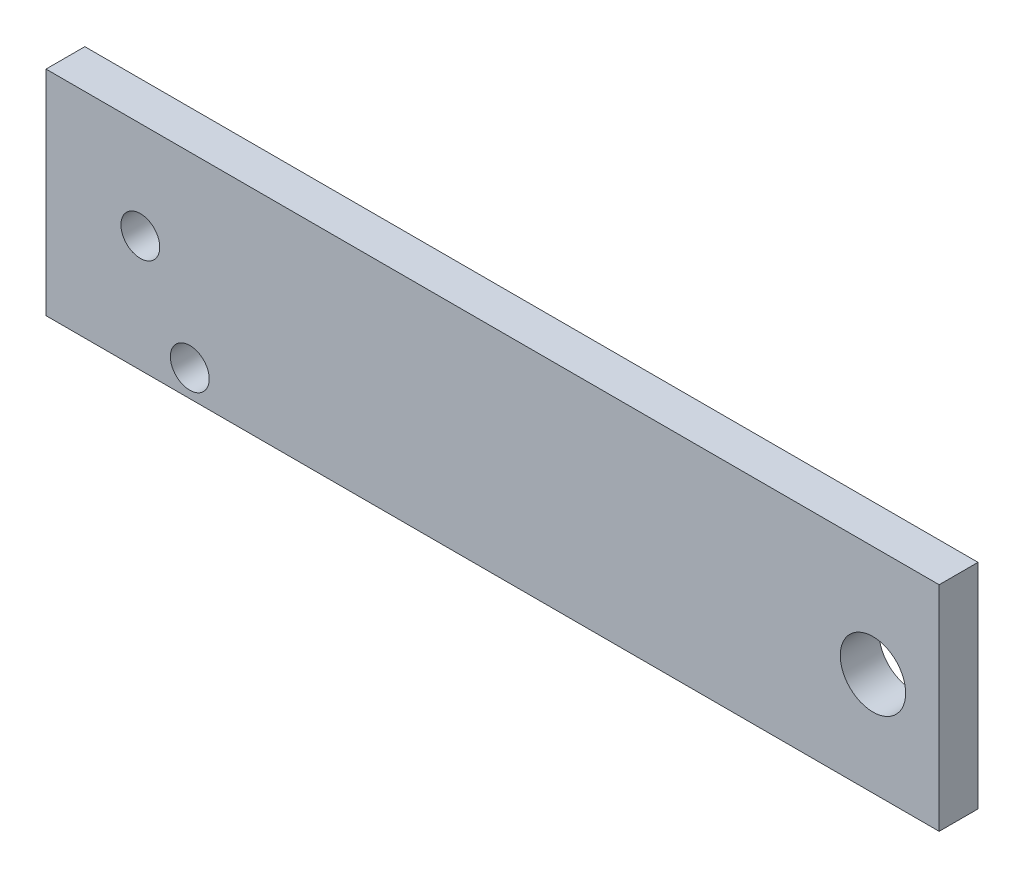
ISO-10303-21;
HEADER;
FILE_DESCRIPTION(('STEP AP214'),'2;1');
FILE_NAME('part.step','',(''),(''),'','','');
FILE_SCHEMA(('AUTOMOTIVE_DESIGN { 1 0 10303 214 1 1 1 1 }'));
ENDSEC;
DATA;
#1=APPLICATION_CONTEXT('core data for automotive mechanical design processes');
#2=APPLICATION_PROTOCOL_DEFINITION('international standard','automotive_design',2000,#1);
#3=PRODUCT_CONTEXT('',#1,'mechanical');
#4=PRODUCT('Part','Part','',(#3));
#5=PRODUCT_RELATED_PRODUCT_CATEGORY('part','',(#4));
#6=PRODUCT_DEFINITION_FORMATION('','',#4);
#7=PRODUCT_DEFINITION_CONTEXT('part definition',#1,'design');
#8=PRODUCT_DEFINITION('design','',#6,#7);
#9=PRODUCT_DEFINITION_SHAPE('','',#8);
#10=(LENGTH_UNIT() NAMED_UNIT(*) SI_UNIT(.MILLI.,.METRE.));
#11=(NAMED_UNIT(*) PLANE_ANGLE_UNIT() SI_UNIT($,.RADIAN.));
#12=(NAMED_UNIT(*) SI_UNIT($,.STERADIAN.) SOLID_ANGLE_UNIT());
#13=UNCERTAINTY_MEASURE_WITH_UNIT(LENGTH_MEASURE(1.E-05),#10,'distance_accuracy_value','');
#14=(GEOMETRIC_REPRESENTATION_CONTEXT(3) GLOBAL_UNCERTAINTY_ASSIGNED_CONTEXT((#13)) GLOBAL_UNIT_ASSIGNED_CONTEXT((#10,
#11,#12)) REPRESENTATION_CONTEXT('',''));
#15=CARTESIAN_POINT('',(0.,0.,0.));
#16=DIRECTION('',(0.,0.,1.));
#17=DIRECTION('',(1.,0.,0.));
#18=AXIS2_PLACEMENT_3D('',#15,#16,#17);
#19=CARTESIAN_POINT('',(0.,0.,20.));
#20=DIRECTION('',(0.,0.,-1.));
#21=DIRECTION('',(-1.,0.,0.));
#22=AXIS2_PLACEMENT_3D('',#19,#20,#21);
#23=PLANE('',#22);
#24=CARTESIAN_POINT('',(-201.422811836563,59.8413845588521,20.));
#25=DIRECTION('',(0.,0.,1.));
#26=DIRECTION('',(1.,0.,0.));
#27=AXIS2_PLACEMENT_3D('',#24,#25,#26);
#28=CIRCLE('',#27,9.99999999999979);
#29=CARTESIAN_POINT('',(-191.422811836563,59.8413845588521,20.));
#30=VERTEX_POINT('',#29);
#31=EDGE_CURVE('E104',#30,#30,#28,.T.);
#32=ORIENTED_EDGE('',*,*,#31,.F.);
#33=EDGE_LOOP('',(#32));
#34=FACE_BOUND('',#33,.T.);
#35=CARTESIAN_POINT('',(175.900033462793,52.9971265455307,20.));
#36=DIRECTION('',(0.,0.,1.));
#37=DIRECTION('',(1.,0.,0.));
#38=AXIS2_PLACEMENT_3D('',#35,#36,#37);
#39=CIRCLE('',#38,16.8442580133217);
#40=CARTESIAN_POINT('',(192.744291476115,52.9971265455307,20.));
#41=VERTEX_POINT('',#40);
#42=EDGE_CURVE('E116',#41,#41,#39,.T.);
#43=ORIENTED_EDGE('',*,*,#42,.F.);
#44=EDGE_LOOP('',(#43));
#45=FACE_BOUND('',#44,.T.);
#46=CARTESIAN_POINT('',(-175.946812600245,13.7777541788056,20.));
#47=DIRECTION('',(0.,0.,1.));
#48=DIRECTION('',(1.,0.,0.));
#49=AXIS2_PLACEMENT_3D('',#46,#47,#48);
#50=CIRCLE('',#49,9.99999999999979);
#51=CARTESIAN_POINT('',(-165.946812600245,13.7777541788056,20.));
#52=VERTEX_POINT('',#51);
#53=EDGE_CURVE('E112',#52,#52,#50,.T.);
#54=ORIENTED_EDGE('',*,*,#53,.F.);
#55=EDGE_LOOP('',(#54));
#56=FACE_BOUND('',#55,.T.);
#57=DIRECTION('',(0.,-1.,0.));
#58=VECTOR('',#57,1.);
#59=CARTESIAN_POINT('',(210.,0.,20.));
#60=LINE('',#59,#58);
#61=CARTESIAN_POINT('',(210.,110.,20.));
#62=VERTEX_POINT('',#61);
#63=CARTESIAN_POINT('',(210.,0.,20.));
#64=VERTEX_POINT('',#63);
#65=EDGE_CURVE('E57',#62,#64,#60,.T.);
#66=ORIENTED_EDGE('',*,*,#65,.F.);
#67=DIRECTION('',(-1.,0.,0.));
#68=VECTOR('',#67,1.);
#69=CARTESIAN_POINT('',(250.,110.,20.));
#70=LINE('',#69,#68);
#71=CARTESIAN_POINT('',(-250.,110.,20.));
#72=VERTEX_POINT('',#71);
#73=EDGE_CURVE('E93',#62,#72,#70,.T.);
#74=ORIENTED_EDGE('',*,*,#73,.T.);
#75=DIRECTION('',(0.,-1.,0.));
#76=VECTOR('',#75,1.);
#77=CARTESIAN_POINT('',(-250.,110.,20.));
#78=LINE('',#77,#76);
#79=CARTESIAN_POINT('',(-250.,2.22044604925031E-13,20.));
#80=VERTEX_POINT('',#79);
#81=EDGE_CURVE('E124',#72,#80,#78,.T.);
#82=ORIENTED_EDGE('',*,*,#81,.T.);
#83=DIRECTION('',(1.,0.,0.));
#84=VECTOR('',#83,1.);
#85=CARTESIAN_POINT('',(250.,0.,20.));
#86=LINE('',#85,#84);
#87=EDGE_CURVE('E123',#80,#64,#86,.T.);
#88=ORIENTED_EDGE('',*,*,#87,.T.);
#89=EDGE_LOOP('',(#66,#74,#82,#88));
#90=FACE_BOUND('',#89,.T.);
#91=ADVANCED_FACE('F41',(#34,#45,#56,#90),#23,.F.);
#92=CARTESIAN_POINT('',(0.,0.,0.));
#93=DIRECTION('',(0.,0.,-1.));
#94=DIRECTION('',(-1.,0.,0.));
#95=AXIS2_PLACEMENT_3D('',#92,#93,#94);
#96=PLANE('',#95);
#97=CARTESIAN_POINT('',(-201.422811836563,59.8413845588521,0.));
#98=DIRECTION('',(0.,0.,1.));
#99=DIRECTION('',(1.,0.,0.));
#100=AXIS2_PLACEMENT_3D('',#97,#98,#99);
#101=CIRCLE('',#100,9.99999999999979);
#102=CARTESIAN_POINT('',(-191.422811836563,59.8413845588521,0.));
#103=VERTEX_POINT('',#102);
#104=EDGE_CURVE('E105',#103,#103,#101,.T.);
#105=ORIENTED_EDGE('',*,*,#104,.T.);
#106=EDGE_LOOP('',(#105));
#107=FACE_BOUND('',#106,.T.);
#108=CARTESIAN_POINT('',(175.900033462793,52.9971265455307,0.));
#109=DIRECTION('',(0.,0.,1.));
#110=DIRECTION('',(1.,0.,0.));
#111=AXIS2_PLACEMENT_3D('',#108,#109,#110);
#112=CIRCLE('',#111,16.8442580133217);
#113=CARTESIAN_POINT('',(192.744291476115,52.9971265455307,0.));
#114=VERTEX_POINT('',#113);
#115=EDGE_CURVE('E111',#114,#114,#112,.T.);
#116=ORIENTED_EDGE('',*,*,#115,.T.);
#117=EDGE_LOOP('',(#116));
#118=FACE_BOUND('',#117,.T.);
#119=CARTESIAN_POINT('',(-175.946812600245,13.7777541788056,0.));
#120=DIRECTION('',(0.,0.,1.));
#121=DIRECTION('',(1.,0.,0.));
#122=AXIS2_PLACEMENT_3D('',#119,#120,#121);
#123=CIRCLE('',#122,9.99999999999979);
#124=CARTESIAN_POINT('',(-165.946812600245,13.7777541788056,0.));
#125=VERTEX_POINT('',#124);
#126=EDGE_CURVE('E107',#125,#125,#123,.T.);
#127=ORIENTED_EDGE('',*,*,#126,.T.);
#128=EDGE_LOOP('',(#127));
#129=FACE_BOUND('',#128,.T.);
#130=DIRECTION('',(-1.,0.,0.));
#131=VECTOR('',#130,1.);
#132=CARTESIAN_POINT('',(250.,110.,0.));
#133=LINE('',#132,#131);
#134=CARTESIAN_POINT('',(210.,110.,0.));
#135=VERTEX_POINT('',#134);
#136=CARTESIAN_POINT('',(-250.,110.,0.));
#137=VERTEX_POINT('',#136);
#138=EDGE_CURVE('E100',#135,#137,#133,.T.);
#139=ORIENTED_EDGE('',*,*,#138,.F.);
#140=DIRECTION('',(0.,-1.,0.));
#141=VECTOR('',#140,1.);
#142=CARTESIAN_POINT('',(210.,0.,0.));
#143=LINE('',#142,#141);
#144=CARTESIAN_POINT('',(210.,0.,0.));
#145=VERTEX_POINT('',#144);
#146=EDGE_CURVE('E92',#135,#145,#143,.T.);
#147=ORIENTED_EDGE('',*,*,#146,.T.);
#148=DIRECTION('',(1.,0.,0.));
#149=VECTOR('',#148,1.);
#150=CARTESIAN_POINT('',(250.,0.,0.));
#151=LINE('',#150,#149);
#152=CARTESIAN_POINT('',(-250.,2.22044604925031E-13,0.));
#153=VERTEX_POINT('',#152);
#154=EDGE_CURVE('E84',#153,#145,#151,.T.);
#155=ORIENTED_EDGE('',*,*,#154,.F.);
#156=DIRECTION('',(0.,-1.,0.));
#157=VECTOR('',#156,1.);
#158=CARTESIAN_POINT('',(-250.,110.,0.));
#159=LINE('',#158,#157);
#160=EDGE_CURVE('E95',#137,#153,#159,.T.);
#161=ORIENTED_EDGE('',*,*,#160,.F.);
#162=EDGE_LOOP('',(#139,#147,#155,#161));
#163=FACE_BOUND('',#162,.T.);
#164=ADVANCED_FACE('F96',(#107,#118,#129,#163),#96,.T.);
#165=CARTESIAN_POINT('',(250.,110.,20.));
#166=DIRECTION('',(0.,-1.,0.));
#167=DIRECTION('',(1.,0.,0.));
#168=AXIS2_PLACEMENT_3D('',#165,#166,#167);
#169=PLANE('',#168);
#170=DIRECTION('',(0.,0.,1.));
#171=VECTOR('',#170,1.);
#172=CARTESIAN_POINT('',(210.,110.,20.));
#173=LINE('',#172,#171);
#174=EDGE_CURVE('E65',#135,#62,#173,.T.);
#175=ORIENTED_EDGE('',*,*,#174,.F.);
#176=ORIENTED_EDGE('',*,*,#138,.T.);
#177=DIRECTION('',(0.,0.,-1.));
#178=VECTOR('',#177,1.);
#179=CARTESIAN_POINT('',(-250.,110.,20.));
#180=LINE('',#179,#178);
#181=EDGE_CURVE('E47',#72,#137,#180,.T.);
#182=ORIENTED_EDGE('',*,*,#181,.F.);
#183=ORIENTED_EDGE('',*,*,#73,.F.);
#184=EDGE_LOOP('',(#175,#176,#182,#183));
#185=FACE_BOUND('',#184,.T.);
#186=ADVANCED_FACE('F43',(#185),#169,.F.);
#187=CARTESIAN_POINT('',(250.,0.,20.));
#188=DIRECTION('',(0.,1.,0.));
#189=DIRECTION('',(-1.,0.,0.));
#190=AXIS2_PLACEMENT_3D('',#187,#188,#189);
#191=PLANE('',#190);
#192=DIRECTION('',(0.,0.,-1.));
#193=VECTOR('',#192,1.);
#194=CARTESIAN_POINT('',(210.,0.,20.));
#195=LINE('',#194,#193);
#196=EDGE_CURVE('E11',#64,#145,#195,.T.);
#197=ORIENTED_EDGE('',*,*,#196,.F.);
#198=ORIENTED_EDGE('',*,*,#87,.F.);
#199=DIRECTION('',(0.,0.,-1.));
#200=VECTOR('',#199,1.);
#201=CARTESIAN_POINT('',(-250.,2.22044604925031E-13,20.));
#202=LINE('',#201,#200);
#203=EDGE_CURVE('E86',#80,#153,#202,.T.);
#204=ORIENTED_EDGE('',*,*,#203,.T.);
#205=ORIENTED_EDGE('',*,*,#154,.T.);
#206=EDGE_LOOP('',(#197,#198,#204,#205));
#207=FACE_BOUND('',#206,.T.);
#208=ADVANCED_FACE('F83',(#207),#191,.F.);
#209=CARTESIAN_POINT('',(-250.,110.,20.));
#210=DIRECTION('',(1.,0.,0.));
#211=DIRECTION('',(0.,0.,-1.));
#212=AXIS2_PLACEMENT_3D('',#209,#210,#211);
#213=PLANE('',#212);
#214=ORIENTED_EDGE('',*,*,#160,.T.);
#215=ORIENTED_EDGE('',*,*,#203,.F.);
#216=ORIENTED_EDGE('',*,*,#81,.F.);
#217=ORIENTED_EDGE('',*,*,#181,.T.);
#218=EDGE_LOOP('',(#214,#215,#216,#217));
#219=FACE_BOUND('',#218,.T.);
#220=ADVANCED_FACE('F135',(#219),#213,.F.);
#221=CARTESIAN_POINT('',(175.900033462793,52.9971265455307,20.));
#222=DIRECTION('',(0.,0.,-1.));
#223=DIRECTION('',(-1.,0.,0.));
#224=AXIS2_PLACEMENT_3D('',#221,#222,#223);
#225=CYLINDRICAL_SURFACE('',#224,16.8442580133217);
#226=ORIENTED_EDGE('',*,*,#42,.T.);
#227=EDGE_LOOP('',(#226));
#228=FACE_BOUND('',#227,.T.);
#229=ORIENTED_EDGE('',*,*,#115,.F.);
#230=EDGE_LOOP('',(#229));
#231=FACE_BOUND('',#230,.T.);
#232=ADVANCED_FACE('F148',(#228,#231),#225,.F.);
#233=CARTESIAN_POINT('',(-175.946812600245,13.7777541788056,20.));
#234=DIRECTION('',(0.,0.,-1.));
#235=DIRECTION('',(-1.,0.,0.));
#236=AXIS2_PLACEMENT_3D('',#233,#234,#235);
#237=CYLINDRICAL_SURFACE('',#236,9.99999999999979);
#238=ORIENTED_EDGE('',*,*,#53,.T.);
#239=EDGE_LOOP('',(#238));
#240=FACE_BOUND('',#239,.T.);
#241=ORIENTED_EDGE('',*,*,#126,.F.);
#242=EDGE_LOOP('',(#241));
#243=FACE_BOUND('',#242,.T.);
#244=ADVANCED_FACE('F152',(#240,#243),#237,.F.);
#245=CARTESIAN_POINT('',(-201.422811836563,59.8413845588521,20.));
#246=DIRECTION('',(0.,0.,-1.));
#247=DIRECTION('',(-1.,0.,0.));
#248=AXIS2_PLACEMENT_3D('',#245,#246,#247);
#249=CYLINDRICAL_SURFACE('',#248,9.99999999999979);
#250=ORIENTED_EDGE('',*,*,#31,.T.);
#251=EDGE_LOOP('',(#250));
#252=FACE_BOUND('',#251,.T.);
#253=ORIENTED_EDGE('',*,*,#104,.F.);
#254=EDGE_LOOP('',(#253));
#255=FACE_BOUND('',#254,.T.);
#256=ADVANCED_FACE('F157',(#252,#255),#249,.F.);
#257=CARTESIAN_POINT('',(210.,138.809132379514,660.434422872476));
#258=DIRECTION('',(1.,0.,0.));
#259=DIRECTION('',(0.,0.,-1.));
#260=AXIS2_PLACEMENT_3D('',#257,#258,#259);
#261=PLANE('',#260);
#262=ORIENTED_EDGE('',*,*,#146,.F.);
#263=ORIENTED_EDGE('',*,*,#174,.T.);
#264=ORIENTED_EDGE('',*,*,#65,.T.);
#265=ORIENTED_EDGE('',*,*,#196,.T.);
#266=EDGE_LOOP('',(#262,#263,#264,#265));
#267=FACE_BOUND('',#266,.T.);
#268=ADVANCED_FACE('F99',(#267),#261,.T.);
#269=CLOSED_SHELL('',(#91,#164,#186,#208,#220,#232,#244,#256,#268));
#270=MANIFOLD_SOLID_BREP('B2',#269);
#271=ADVANCED_BREP_SHAPE_REPRESENTATION('',(#18,#270),#14);
#272=SHAPE_DEFINITION_REPRESENTATION(#9,#271);
ENDSEC;
END-ISO-10303-21;
